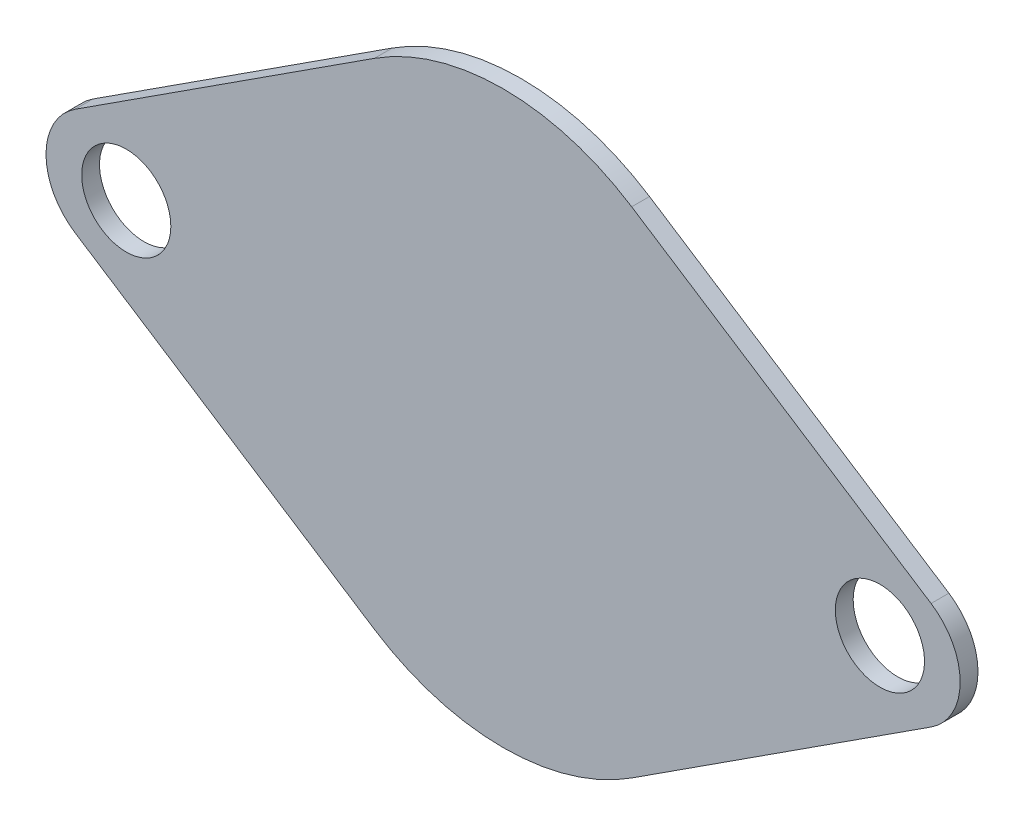
ISO-10303-21;
HEADER;
FILE_DESCRIPTION(('STEP AP214'),'2;1');
FILE_NAME('part.step','',(''),(''),'','','');
FILE_SCHEMA(('AUTOMOTIVE_DESIGN { 1 0 10303 214 1 1 1 1 }'));
ENDSEC;
DATA;
#1=APPLICATION_CONTEXT('core data for automotive mechanical design processes');
#2=APPLICATION_PROTOCOL_DEFINITION('international standard','automotive_design',2000,#1);
#3=PRODUCT_CONTEXT('',#1,'mechanical');
#4=PRODUCT('Part','Part','',(#3));
#5=PRODUCT_RELATED_PRODUCT_CATEGORY('part','',(#4));
#6=PRODUCT_DEFINITION_FORMATION('','',#4);
#7=PRODUCT_DEFINITION_CONTEXT('part definition',#1,'design');
#8=PRODUCT_DEFINITION('design','',#6,#7);
#9=PRODUCT_DEFINITION_SHAPE('','',#8);
#10=(LENGTH_UNIT() NAMED_UNIT(*) SI_UNIT(.MILLI.,.METRE.));
#11=(NAMED_UNIT(*) PLANE_ANGLE_UNIT() SI_UNIT($,.RADIAN.));
#12=(NAMED_UNIT(*) SI_UNIT($,.STERADIAN.) SOLID_ANGLE_UNIT());
#13=UNCERTAINTY_MEASURE_WITH_UNIT(LENGTH_MEASURE(1.E-05),#10,'distance_accuracy_value','');
#14=(GEOMETRIC_REPRESENTATION_CONTEXT(3) GLOBAL_UNCERTAINTY_ASSIGNED_CONTEXT((#13)) GLOBAL_UNIT_ASSIGNED_CONTEXT((#10,
#11,#12)) REPRESENTATION_CONTEXT('',''));
#15=CARTESIAN_POINT('',(0.,0.,0.));
#16=DIRECTION('',(0.,0.,1.));
#17=DIRECTION('',(1.,0.,0.));
#18=AXIS2_PLACEMENT_3D('',#15,#16,#17);
#19=CARTESIAN_POINT('',(1.94227504244482,-3.,1.));
#20=DIRECTION('',(0.,0.,1.));
#21=DIRECTION('',(1.,0.,0.));
#22=AXIS2_PLACEMENT_3D('',#19,#20,#21);
#23=PLANE('',#22);
#24=CARTESIAN_POINT('',(2.86842105263158,-3.,1.));
#25=DIRECTION('',(0.,0.,1.));
#26=DIRECTION('',(1.,0.,0.));
#27=AXIS2_PLACEMENT_3D('',#24,#25,#26);
#28=CIRCLE('',#27,2.5);
#29=CARTESIAN_POINT('',(5.36842105263158,-3.,1.));
#30=VERTEX_POINT('',#29);
#31=EDGE_CURVE('E134',#30,#30,#28,.T.);
#32=ORIENTED_EDGE('',*,*,#31,.F.);
#33=EDGE_LOOP('',(#32));
#34=FACE_BOUND('',#33,.T.);
#35=CARTESIAN_POINT('',(1.94227504244482,-3.,1.));
#36=DIRECTION('',(0.,0.,1.));
#37=DIRECTION('',(1.,0.,0.));
#38=AXIS2_PLACEMENT_3D('',#35,#36,#37);
#39=CIRCLE('',#38,3.57385398981324);
#40=CARTESIAN_POINT('',(0.,0.,1.));
#41=VERTEX_POINT('',#40);
#42=CARTESIAN_POINT('',(0.,-6.,1.));
#43=VERTEX_POINT('',#42);
#44=EDGE_CURVE('E145',#41,#43,#39,.T.);
#45=ORIENTED_EDGE('',*,*,#44,.T.);
#46=DIRECTION('',(0.839429928741093,-0.543467933491687,0.));
#47=VECTOR('',#46,1.);
#48=CARTESIAN_POINT('',(0.,-6.,1.));
#49=LINE('',#48,#47);
#50=CARTESIAN_POINT('',(16.7885985748218,-16.8693586698337,1.));
#51=VERTEX_POINT('',#50);
#52=EDGE_CURVE('E93',#43,#51,#49,.T.);
#53=ORIENTED_EDGE('',*,*,#52,.T.);
#54=CARTESIAN_POINT('',(24.,-5.73076923076923,1.));
#55=DIRECTION('',(0.,0.,1.));
#56=DIRECTION('',(1.,0.,0.));
#57=AXIS2_PLACEMENT_3D('',#54,#55,#56);
#58=CIRCLE('',#57,13.2692307692308);
#59=CARTESIAN_POINT('',(31.2114014251781,-16.8693586698337,1.));
#60=VERTEX_POINT('',#59);
#61=EDGE_CURVE('E160',#51,#60,#58,.T.);
#62=ORIENTED_EDGE('',*,*,#61,.T.);
#63=DIRECTION('',(0.839429928741093,0.543467933491687,0.));
#64=VECTOR('',#63,1.);
#65=CARTESIAN_POINT('',(48.,-6.,1.));
#66=LINE('',#65,#64);
#67=CARTESIAN_POINT('',(48.,-6.,1.));
#68=VERTEX_POINT('',#67);
#69=EDGE_CURVE('E173',#60,#68,#66,.T.);
#70=ORIENTED_EDGE('',*,*,#69,.T.);
#71=CARTESIAN_POINT('',(46.0577249575552,-3.,1.));
#72=DIRECTION('',(0.,0.,1.));
#73=DIRECTION('',(-1.,0.,0.));
#74=AXIS2_PLACEMENT_3D('',#71,#72,#73);
#75=CIRCLE('',#74,3.57385398981324);
#76=CARTESIAN_POINT('',(48.,0.,1.));
#77=VERTEX_POINT('',#76);
#78=EDGE_CURVE('E112',#68,#77,#75,.T.);
#79=ORIENTED_EDGE('',*,*,#78,.T.);
#80=DIRECTION('',(-0.839429928741093,0.543467933491686,0.));
#81=VECTOR('',#80,1.);
#82=CARTESIAN_POINT('',(31.2114014251781,10.8693586698337,1.));
#83=LINE('',#82,#81);
#84=CARTESIAN_POINT('',(31.2114014251781,10.8693586698337,1.));
#85=VERTEX_POINT('',#84);
#86=EDGE_CURVE('E106',#77,#85,#83,.T.);
#87=ORIENTED_EDGE('',*,*,#86,.T.);
#88=CARTESIAN_POINT('',(24.,-0.269230769230772,1.));
#89=DIRECTION('',(0.,0.,1.));
#90=DIRECTION('',(-1.,0.,0.));
#91=AXIS2_PLACEMENT_3D('',#88,#89,#90);
#92=CIRCLE('',#91,13.2692307692308);
#93=CARTESIAN_POINT('',(16.7885985748219,10.8693586698337,1.));
#94=VERTEX_POINT('',#93);
#95=EDGE_CURVE('E110',#85,#94,#92,.T.);
#96=ORIENTED_EDGE('',*,*,#95,.T.);
#97=DIRECTION('',(-0.839429928741093,-0.543467933491686,0.));
#98=VECTOR('',#97,1.);
#99=CARTESIAN_POINT('',(0.,0.,1.));
#100=LINE('',#99,#98);
#101=EDGE_CURVE('E50',#94,#41,#100,.T.);
#102=ORIENTED_EDGE('',*,*,#101,.T.);
#103=EDGE_LOOP('',(#45,#53,#62,#70,#79,#87,#96,#102));
#104=FACE_BOUND('',#103,.T.);
#105=CARTESIAN_POINT('',(45.1315789473684,-2.99999999999999,1.));
#106=DIRECTION('',(0.,0.,1.));
#107=DIRECTION('',(-1.,0.,0.));
#108=AXIS2_PLACEMENT_3D('',#105,#106,#107);
#109=CIRCLE('',#108,2.49999999999999);
#110=CARTESIAN_POINT('',(42.6315789473684,-2.99999999999999,1.));
#111=VERTEX_POINT('',#110);
#112=EDGE_CURVE('E182',#111,#111,#109,.T.);
#113=ORIENTED_EDGE('',*,*,#112,.F.);
#114=EDGE_LOOP('',(#113));
#115=FACE_BOUND('',#114,.T.);
#116=ADVANCED_FACE('F33',(#34,#104,#115),#23,.T.);
#117=CARTESIAN_POINT('',(1.94227504244482,-3.,0.));
#118=DIRECTION('',(0.,0.,1.));
#119=DIRECTION('',(1.,0.,0.));
#120=AXIS2_PLACEMENT_3D('',#117,#118,#119);
#121=PLANE('',#120);
#122=CARTESIAN_POINT('',(1.94227504244482,-3.,0.));
#123=DIRECTION('',(0.,0.,1.));
#124=DIRECTION('',(1.,0.,0.));
#125=AXIS2_PLACEMENT_3D('',#122,#123,#124);
#126=CIRCLE('',#125,3.57385398981324);
#127=CARTESIAN_POINT('',(0.,0.,0.));
#128=VERTEX_POINT('',#127);
#129=CARTESIAN_POINT('',(0.,-6.,0.));
#130=VERTEX_POINT('',#129);
#131=EDGE_CURVE('E130',#128,#130,#126,.T.);
#132=ORIENTED_EDGE('',*,*,#131,.F.);
#133=DIRECTION('',(-0.839429928741093,-0.543467933491686,0.));
#134=VECTOR('',#133,1.);
#135=CARTESIAN_POINT('',(0.,0.,0.));
#136=LINE('',#135,#134);
#137=CARTESIAN_POINT('',(16.7885985748219,10.8693586698337,0.));
#138=VERTEX_POINT('',#137);
#139=EDGE_CURVE('E85',#138,#128,#136,.T.);
#140=ORIENTED_EDGE('',*,*,#139,.F.);
#141=CARTESIAN_POINT('',(24.,-0.269230769230772,0.));
#142=DIRECTION('',(0.,0.,1.));
#143=DIRECTION('',(-1.,0.,0.));
#144=AXIS2_PLACEMENT_3D('',#141,#142,#143);
#145=CIRCLE('',#144,13.2692307692308);
#146=CARTESIAN_POINT('',(31.2114014251781,10.8693586698337,0.));
#147=VERTEX_POINT('',#146);
#148=EDGE_CURVE('E79',#147,#138,#145,.T.);
#149=ORIENTED_EDGE('',*,*,#148,.F.);
#150=DIRECTION('',(-0.839429928741093,0.543467933491686,0.));
#151=VECTOR('',#150,1.);
#152=CARTESIAN_POINT('',(31.2114014251781,10.8693586698337,0.));
#153=LINE('',#152,#151);
#154=CARTESIAN_POINT('',(48.,0.,0.));
#155=VERTEX_POINT('',#154);
#156=EDGE_CURVE('E120',#155,#147,#153,.T.);
#157=ORIENTED_EDGE('',*,*,#156,.F.);
#158=CARTESIAN_POINT('',(46.0577249575552,-3.,0.));
#159=DIRECTION('',(0.,0.,1.));
#160=DIRECTION('',(-1.,0.,0.));
#161=AXIS2_PLACEMENT_3D('',#158,#159,#160);
#162=CIRCLE('',#161,3.57385398981324);
#163=CARTESIAN_POINT('',(48.,-6.,0.));
#164=VERTEX_POINT('',#163);
#165=EDGE_CURVE('E140',#164,#155,#162,.T.);
#166=ORIENTED_EDGE('',*,*,#165,.F.);
#167=DIRECTION('',(0.839429928741093,0.543467933491687,0.));
#168=VECTOR('',#167,1.);
#169=CARTESIAN_POINT('',(48.,-6.,0.));
#170=LINE('',#169,#168);
#171=CARTESIAN_POINT('',(31.2114014251781,-16.8693586698337,0.));
#172=VERTEX_POINT('',#171);
#173=EDGE_CURVE('E138',#172,#164,#170,.T.);
#174=ORIENTED_EDGE('',*,*,#173,.F.);
#175=CARTESIAN_POINT('',(24.,-5.73076923076923,0.));
#176=DIRECTION('',(0.,0.,1.));
#177=DIRECTION('',(1.,0.,0.));
#178=AXIS2_PLACEMENT_3D('',#175,#176,#177);
#179=CIRCLE('',#178,13.2692307692308);
#180=CARTESIAN_POINT('',(16.7885985748218,-16.8693586698337,0.));
#181=VERTEX_POINT('',#180);
#182=EDGE_CURVE('E136',#181,#172,#179,.T.);
#183=ORIENTED_EDGE('',*,*,#182,.F.);
#184=DIRECTION('',(0.839429928741093,-0.543467933491687,0.));
#185=VECTOR('',#184,1.);
#186=CARTESIAN_POINT('',(0.,-6.,0.));
#187=LINE('',#186,#185);
#188=EDGE_CURVE('E133',#130,#181,#187,.T.);
#189=ORIENTED_EDGE('',*,*,#188,.F.);
#190=EDGE_LOOP('',(#132,#140,#149,#157,#166,#174,#183,#189));
#191=FACE_BOUND('',#190,.T.);
#192=CARTESIAN_POINT('',(2.86842105263158,-3.,0.));
#193=DIRECTION('',(0.,0.,1.));
#194=DIRECTION('',(1.,0.,0.));
#195=AXIS2_PLACEMENT_3D('',#192,#193,#194);
#196=CIRCLE('',#195,2.5);
#197=CARTESIAN_POINT('',(5.36842105263158,-3.,0.));
#198=VERTEX_POINT('',#197);
#199=EDGE_CURVE('E179',#198,#198,#196,.T.);
#200=ORIENTED_EDGE('',*,*,#199,.T.);
#201=EDGE_LOOP('',(#200));
#202=FACE_BOUND('',#201,.T.);
#203=CARTESIAN_POINT('',(45.1315789473684,-2.99999999999999,0.));
#204=DIRECTION('',(0.,0.,1.));
#205=DIRECTION('',(-1.,0.,0.));
#206=AXIS2_PLACEMENT_3D('',#203,#204,#205);
#207=CIRCLE('',#206,2.49999999999999);
#208=CARTESIAN_POINT('',(42.6315789473684,-2.99999999999999,0.));
#209=VERTEX_POINT('',#208);
#210=EDGE_CURVE('E185',#209,#209,#207,.T.);
#211=ORIENTED_EDGE('',*,*,#210,.T.);
#212=EDGE_LOOP('',(#211));
#213=FACE_BOUND('',#212,.T.);
#214=ADVANCED_FACE('F164',(#191,#202,#213),#121,.F.);
#215=CARTESIAN_POINT('',(1.94227504244482,-3.,1.));
#216=DIRECTION('',(0.,0.,-1.));
#217=DIRECTION('',(-1.,0.,0.));
#218=AXIS2_PLACEMENT_3D('',#215,#216,#217);
#219=CYLINDRICAL_SURFACE('',#218,3.57385398981324);
#220=ORIENTED_EDGE('',*,*,#131,.T.);
#221=DIRECTION('',(0.,0.,-1.));
#222=VECTOR('',#221,1.);
#223=CARTESIAN_POINT('',(0.,-6.,1.));
#224=LINE('',#223,#222);
#225=EDGE_CURVE('E11',#43,#130,#224,.T.);
#226=ORIENTED_EDGE('',*,*,#225,.F.);
#227=ORIENTED_EDGE('',*,*,#44,.F.);
#228=DIRECTION('',(0.,0.,-1.));
#229=VECTOR('',#228,1.);
#230=CARTESIAN_POINT('',(0.,0.,1.));
#231=LINE('',#230,#229);
#232=EDGE_CURVE('E126',#41,#128,#231,.T.);
#233=ORIENTED_EDGE('',*,*,#232,.T.);
#234=EDGE_LOOP('',(#220,#226,#227,#233));
#235=FACE_BOUND('',#234,.T.);
#236=ADVANCED_FACE('F35',(#235),#219,.T.);
#237=CARTESIAN_POINT('',(0.,-6.,1.));
#238=DIRECTION('',(0.543467933491687,0.839429928741093,0.));
#239=DIRECTION('',(-0.839429928741093,0.543467933491687,0.));
#240=AXIS2_PLACEMENT_3D('',#237,#238,#239);
#241=PLANE('',#240);
#242=ORIENTED_EDGE('',*,*,#188,.T.);
#243=DIRECTION('',(0.,0.,-1.));
#244=VECTOR('',#243,1.);
#245=CARTESIAN_POINT('',(16.7885985748218,-16.8693586698337,1.));
#246=LINE('',#245,#244);
#247=EDGE_CURVE('E42',#51,#181,#246,.T.);
#248=ORIENTED_EDGE('',*,*,#247,.F.);
#249=ORIENTED_EDGE('',*,*,#52,.F.);
#250=ORIENTED_EDGE('',*,*,#225,.T.);
#251=EDGE_LOOP('',(#242,#248,#249,#250));
#252=FACE_BOUND('',#251,.T.);
#253=ADVANCED_FACE('F217',(#252),#241,.F.);
#254=CARTESIAN_POINT('',(24.,-5.73076923076923,1.));
#255=DIRECTION('',(0.,0.,-1.));
#256=DIRECTION('',(-1.,0.,0.));
#257=AXIS2_PLACEMENT_3D('',#254,#255,#256);
#258=CYLINDRICAL_SURFACE('',#257,13.2692307692308);
#259=ORIENTED_EDGE('',*,*,#182,.T.);
#260=DIRECTION('',(0.,0.,-1.));
#261=VECTOR('',#260,1.);
#262=CARTESIAN_POINT('',(31.2114014251781,-16.8693586698337,1.));
#263=LINE('',#262,#261);
#264=EDGE_CURVE('E152',#60,#172,#263,.T.);
#265=ORIENTED_EDGE('',*,*,#264,.F.);
#266=ORIENTED_EDGE('',*,*,#61,.F.);
#267=ORIENTED_EDGE('',*,*,#247,.T.);
#268=EDGE_LOOP('',(#259,#265,#266,#267));
#269=FACE_BOUND('',#268,.T.);
#270=ADVANCED_FACE('F158',(#269),#258,.T.);
#271=CARTESIAN_POINT('',(48.,-6.,1.));
#272=DIRECTION('',(-0.543467933491687,0.839429928741093,0.));
#273=DIRECTION('',(-0.839429928741093,-0.543467933491687,0.));
#274=AXIS2_PLACEMENT_3D('',#271,#272,#273);
#275=PLANE('',#274);
#276=ORIENTED_EDGE('',*,*,#173,.T.);
#277=DIRECTION('',(0.,0.,-1.));
#278=VECTOR('',#277,1.);
#279=CARTESIAN_POINT('',(48.,-6.,1.));
#280=LINE('',#279,#278);
#281=EDGE_CURVE('E149',#68,#164,#280,.T.);
#282=ORIENTED_EDGE('',*,*,#281,.F.);
#283=ORIENTED_EDGE('',*,*,#69,.F.);
#284=ORIENTED_EDGE('',*,*,#264,.T.);
#285=EDGE_LOOP('',(#276,#282,#283,#284));
#286=FACE_BOUND('',#285,.T.);
#287=ADVANCED_FACE('F169',(#286),#275,.F.);
#288=CARTESIAN_POINT('',(46.0577249575552,-3.,1.));
#289=DIRECTION('',(0.,0.,-1.));
#290=DIRECTION('',(-1.,0.,0.));
#291=AXIS2_PLACEMENT_3D('',#288,#289,#290);
#292=CYLINDRICAL_SURFACE('',#291,3.57385398981324);
#293=ORIENTED_EDGE('',*,*,#165,.T.);
#294=DIRECTION('',(0.,0.,-1.));
#295=VECTOR('',#294,1.);
#296=CARTESIAN_POINT('',(48.,0.,1.));
#297=LINE('',#296,#295);
#298=EDGE_CURVE('E121',#77,#155,#297,.T.);
#299=ORIENTED_EDGE('',*,*,#298,.F.);
#300=ORIENTED_EDGE('',*,*,#78,.F.);
#301=ORIENTED_EDGE('',*,*,#281,.T.);
#302=EDGE_LOOP('',(#293,#299,#300,#301));
#303=FACE_BOUND('',#302,.T.);
#304=ADVANCED_FACE('F172',(#303),#292,.T.);
#305=CARTESIAN_POINT('',(31.2114014251781,10.8693586698337,1.));
#306=DIRECTION('',(-0.543467933491686,-0.839429928741093,0.));
#307=DIRECTION('',(0.839429928741093,-0.543467933491686,0.));
#308=AXIS2_PLACEMENT_3D('',#305,#306,#307);
#309=PLANE('',#308);
#310=ORIENTED_EDGE('',*,*,#156,.T.);
#311=DIRECTION('',(0.,0.,-1.));
#312=VECTOR('',#311,1.);
#313=CARTESIAN_POINT('',(31.2114014251781,10.8693586698337,1.));
#314=LINE('',#313,#312);
#315=EDGE_CURVE('E117',#85,#147,#314,.T.);
#316=ORIENTED_EDGE('',*,*,#315,.F.);
#317=ORIENTED_EDGE('',*,*,#86,.F.);
#318=ORIENTED_EDGE('',*,*,#298,.T.);
#319=EDGE_LOOP('',(#310,#316,#317,#318));
#320=FACE_BOUND('',#319,.T.);
#321=ADVANCED_FACE('F118',(#320),#309,.F.);
#322=CARTESIAN_POINT('',(24.,-0.269230769230772,1.));
#323=DIRECTION('',(0.,0.,-1.));
#324=DIRECTION('',(-1.,0.,0.));
#325=AXIS2_PLACEMENT_3D('',#322,#323,#324);
#326=CYLINDRICAL_SURFACE('',#325,13.2692307692308);
#327=ORIENTED_EDGE('',*,*,#148,.T.);
#328=DIRECTION('',(0.,0.,-1.));
#329=VECTOR('',#328,1.);
#330=CARTESIAN_POINT('',(16.7885985748219,10.8693586698337,1.));
#331=LINE('',#330,#329);
#332=EDGE_CURVE('E122',#94,#138,#331,.T.);
#333=ORIENTED_EDGE('',*,*,#332,.F.);
#334=ORIENTED_EDGE('',*,*,#95,.F.);
#335=ORIENTED_EDGE('',*,*,#315,.T.);
#336=EDGE_LOOP('',(#327,#333,#334,#335));
#337=FACE_BOUND('',#336,.T.);
#338=ADVANCED_FACE('F124',(#337),#326,.T.);
#339=CARTESIAN_POINT('',(0.,0.,1.));
#340=DIRECTION('',(0.543467933491687,-0.839429928741093,0.));
#341=DIRECTION('',(0.839429928741093,0.543467933491687,0.));
#342=AXIS2_PLACEMENT_3D('',#339,#340,#341);
#343=PLANE('',#342);
#344=ORIENTED_EDGE('',*,*,#139,.T.);
#345=ORIENTED_EDGE('',*,*,#232,.F.);
#346=ORIENTED_EDGE('',*,*,#101,.F.);
#347=ORIENTED_EDGE('',*,*,#332,.T.);
#348=EDGE_LOOP('',(#344,#345,#346,#347));
#349=FACE_BOUND('',#348,.T.);
#350=ADVANCED_FACE('F205',(#349),#343,.F.);
#351=CARTESIAN_POINT('',(2.86842105263158,-3.,1.));
#352=DIRECTION('',(0.,0.,-1.));
#353=DIRECTION('',(-1.,0.,0.));
#354=AXIS2_PLACEMENT_3D('',#351,#352,#353);
#355=CYLINDRICAL_SURFACE('',#354,2.5);
#356=ORIENTED_EDGE('',*,*,#31,.T.);
#357=EDGE_LOOP('',(#356));
#358=FACE_BOUND('',#357,.T.);
#359=ORIENTED_EDGE('',*,*,#199,.F.);
#360=EDGE_LOOP('',(#359));
#361=FACE_BOUND('',#360,.T.);
#362=ADVANCED_FACE('F202',(#358,#361),#355,.F.);
#363=CARTESIAN_POINT('',(45.1315789473684,-2.99999999999999,1.));
#364=DIRECTION('',(0.,0.,-1.));
#365=DIRECTION('',(-1.,0.,0.));
#366=AXIS2_PLACEMENT_3D('',#363,#364,#365);
#367=CYLINDRICAL_SURFACE('',#366,2.49999999999999);
#368=ORIENTED_EDGE('',*,*,#112,.T.);
#369=EDGE_LOOP('',(#368));
#370=FACE_BOUND('',#369,.T.);
#371=ORIENTED_EDGE('',*,*,#210,.F.);
#372=EDGE_LOOP('',(#371));
#373=FACE_BOUND('',#372,.T.);
#374=ADVANCED_FACE('F191',(#370,#373),#367,.F.);
#375=CLOSED_SHELL('',(#116,#214,#236,#253,#270,#287,#304,#321,#338,#350,#362,#374));
#376=MANIFOLD_SOLID_BREP('B2',#375);
#377=ADVANCED_BREP_SHAPE_REPRESENTATION('',(#18,#376),#14);
#378=SHAPE_DEFINITION_REPRESENTATION(#9,#377);
ENDSEC;
END-ISO-10303-21;
